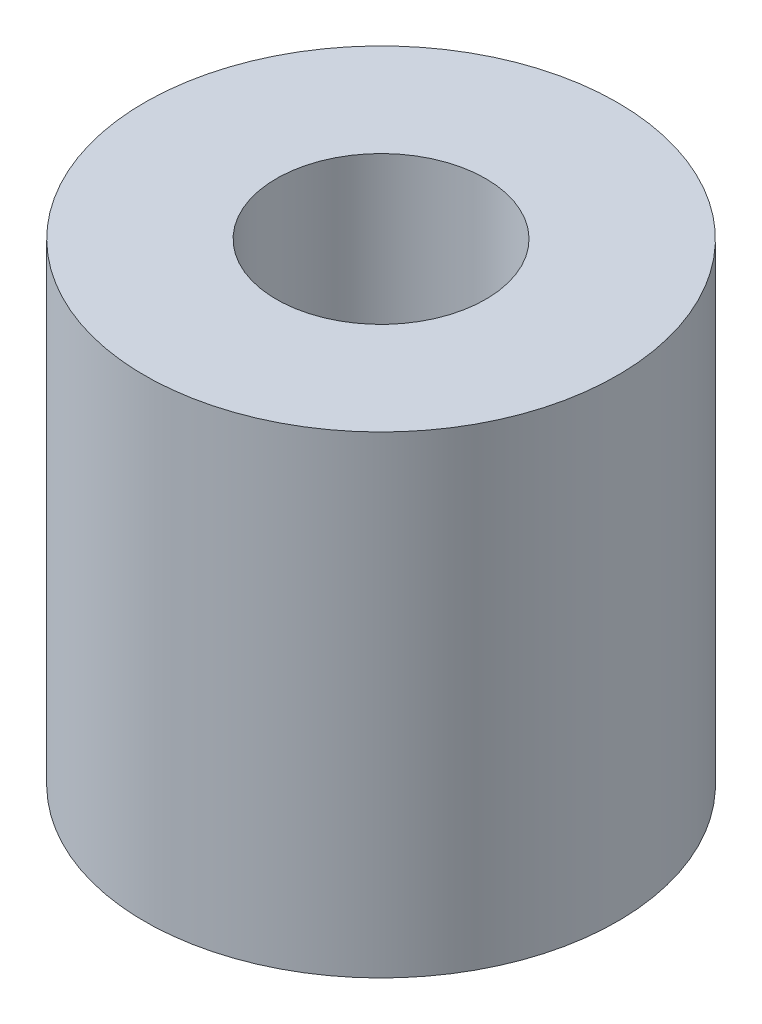
ISO-10303-21;
HEADER;
FILE_DESCRIPTION(('STEP AP214'),'2;1');
FILE_NAME('part.step','',(''),(''),'','','');
FILE_SCHEMA(('AUTOMOTIVE_DESIGN { 1 0 10303 214 1 1 1 1 }'));
ENDSEC;
DATA;
#1=APPLICATION_CONTEXT('core data for automotive mechanical design processes');
#2=APPLICATION_PROTOCOL_DEFINITION('international standard','automotive_design',2000,#1);
#3=PRODUCT_CONTEXT('',#1,'mechanical');
#4=PRODUCT('Part','Part','',(#3));
#5=PRODUCT_RELATED_PRODUCT_CATEGORY('part','',(#4));
#6=PRODUCT_DEFINITION_FORMATION('','',#4);
#7=PRODUCT_DEFINITION_CONTEXT('part definition',#1,'design');
#8=PRODUCT_DEFINITION('design','',#6,#7);
#9=PRODUCT_DEFINITION_SHAPE('','',#8);
#10=(LENGTH_UNIT() NAMED_UNIT(*) SI_UNIT(.MILLI.,.METRE.));
#11=(NAMED_UNIT(*) PLANE_ANGLE_UNIT() SI_UNIT($,.RADIAN.));
#12=(NAMED_UNIT(*) SI_UNIT($,.STERADIAN.) SOLID_ANGLE_UNIT());
#13=UNCERTAINTY_MEASURE_WITH_UNIT(LENGTH_MEASURE(1.E-05),#10,'distance_accuracy_value','');
#14=(GEOMETRIC_REPRESENTATION_CONTEXT(3) GLOBAL_UNCERTAINTY_ASSIGNED_CONTEXT((#13)) GLOBAL_UNIT_ASSIGNED_CONTEXT((#10,
#11,#12)) REPRESENTATION_CONTEXT('',''));
#15=CARTESIAN_POINT('',(0.,0.,0.));
#16=DIRECTION('',(0.,0.,1.));
#17=DIRECTION('',(1.,0.,0.));
#18=AXIS2_PLACEMENT_3D('',#15,#16,#17);
#19=CARTESIAN_POINT('',(0.,9.525,0.));
#20=DIRECTION('',(0.,1.,0.));
#21=DIRECTION('',(0.,0.,1.));
#22=AXIS2_PLACEMENT_3D('',#19,#20,#21);
#23=PLANE('',#22);
#24=CARTESIAN_POINT('',(0.,9.525,0.));
#25=DIRECTION('',(0.,1.,0.));
#26=DIRECTION('',(0.,0.,1.));
#27=AXIS2_PLACEMENT_3D('',#24,#25,#26);
#28=CIRCLE('',#27,4.7625);
#29=CARTESIAN_POINT('',(0.,9.525,-4.7625));
#30=VERTEX_POINT('',#29);
#31=EDGE_CURVE('E10',#30,#30,#28,.T.);
#32=ORIENTED_EDGE('',*,*,#31,.T.);
#33=EDGE_LOOP('',(#32));
#34=FACE_BOUND('',#33,.T.);
#35=CARTESIAN_POINT('',(0.,9.525,0.));
#36=DIRECTION('',(0.,1.,0.));
#37=DIRECTION('',(0.,0.,1.));
#38=AXIS2_PLACEMENT_3D('',#35,#36,#37);
#39=CIRCLE('',#38,2.1082);
#40=CARTESIAN_POINT('',(0.,9.525,-2.1082));
#41=VERTEX_POINT('',#40);
#42=EDGE_CURVE('E50',#41,#41,#39,.T.);
#43=ORIENTED_EDGE('',*,*,#42,.F.);
#44=EDGE_LOOP('',(#43));
#45=FACE_BOUND('',#44,.T.);
#46=ADVANCED_FACE('F37',(#34,#45),#23,.T.);
#47=CARTESIAN_POINT('',(0.,0.,0.));
#48=DIRECTION('',(0.,1.,0.));
#49=DIRECTION('',(0.,0.,1.));
#50=AXIS2_PLACEMENT_3D('',#47,#48,#49);
#51=PLANE('',#50);
#52=CARTESIAN_POINT('',(0.,0.,0.));
#53=DIRECTION('',(0.,1.,0.));
#54=DIRECTION('',(0.,0.,1.));
#55=AXIS2_PLACEMENT_3D('',#52,#53,#54);
#56=CIRCLE('',#55,4.7625);
#57=CARTESIAN_POINT('',(0.,0.,-4.7625));
#58=VERTEX_POINT('',#57);
#59=EDGE_CURVE('E41',#58,#58,#56,.T.);
#60=ORIENTED_EDGE('',*,*,#59,.F.);
#61=EDGE_LOOP('',(#60));
#62=FACE_BOUND('',#61,.T.);
#63=CARTESIAN_POINT('',(0.,0.,0.));
#64=DIRECTION('',(0.,1.,0.));
#65=DIRECTION('',(0.,0.,1.));
#66=AXIS2_PLACEMENT_3D('',#63,#64,#65);
#67=CIRCLE('',#66,2.1082);
#68=CARTESIAN_POINT('',(0.,0.,-2.1082));
#69=VERTEX_POINT('',#68);
#70=EDGE_CURVE('E52',#69,#69,#67,.T.);
#71=ORIENTED_EDGE('',*,*,#70,.T.);
#72=EDGE_LOOP('',(#71));
#73=FACE_BOUND('',#72,.T.);
#74=ADVANCED_FACE('F64',(#62,#73),#51,.F.);
#75=CARTESIAN_POINT('',(0.,9.525,0.));
#76=DIRECTION('',(0.,-1.,0.));
#77=DIRECTION('',(0.,0.,-1.));
#78=AXIS2_PLACEMENT_3D('',#75,#76,#77);
#79=CYLINDRICAL_SURFACE('',#78,4.7625);
#80=CARTESIAN_POINT('',(0.,9.525,-4.7625));
#81=CARTESIAN_POINT('',(0.,9.42578125,-4.7625));
#82=CARTESIAN_POINT('',(0.,9.3265625,-4.7625));
#83=CARTESIAN_POINT('',(0.,9.128125,-4.7625));
#84=CARTESIAN_POINT('',(0.,9.02890625,-4.7625));
#85=CARTESIAN_POINT('',(0.,8.83046875,-4.7625));
#86=CARTESIAN_POINT('',(0.,8.73125,-4.7625));
#87=CARTESIAN_POINT('',(0.,8.5328125,-4.7625));
#88=CARTESIAN_POINT('',(0.,8.43359375,-4.7625));
#89=CARTESIAN_POINT('',(0.,8.23515625,-4.7625));
#90=CARTESIAN_POINT('',(0.,8.1359375,-4.7625));
#91=CARTESIAN_POINT('',(0.,7.9375,-4.7625));
#92=CARTESIAN_POINT('',(0.,7.83828125,-4.7625));
#93=CARTESIAN_POINT('',(0.,7.63984375,-4.7625));
#94=CARTESIAN_POINT('',(0.,7.540625,-4.7625));
#95=CARTESIAN_POINT('',(0.,7.3421875,-4.7625));
#96=CARTESIAN_POINT('',(0.,7.24296875,-4.7625));
#97=CARTESIAN_POINT('',(0.,7.04453125,-4.7625));
#98=CARTESIAN_POINT('',(0.,6.9453125,-4.7625));
#99=CARTESIAN_POINT('',(0.,6.746875,-4.7625));
#100=CARTESIAN_POINT('',(0.,6.64765625,-4.7625));
#101=CARTESIAN_POINT('',(0.,6.44921875,-4.7625));
#102=CARTESIAN_POINT('',(0.,6.35,-4.7625));
#103=CARTESIAN_POINT('',(0.,6.1515625,-4.7625));
#104=CARTESIAN_POINT('',(0.,6.05234375,-4.7625));
#105=CARTESIAN_POINT('',(0.,5.85390625,-4.7625));
#106=CARTESIAN_POINT('',(0.,5.7546875,-4.7625));
#107=CARTESIAN_POINT('',(0.,5.55625,-4.7625));
#108=CARTESIAN_POINT('',(0.,5.45703125,-4.7625));
#109=CARTESIAN_POINT('',(0.,5.25859375,-4.7625));
#110=CARTESIAN_POINT('',(0.,5.159375,-4.7625));
#111=CARTESIAN_POINT('',(0.,4.9609375,-4.7625));
#112=CARTESIAN_POINT('',(0.,4.86171875,-4.7625));
#113=CARTESIAN_POINT('',(0.,4.66328125,-4.7625));
#114=CARTESIAN_POINT('',(0.,4.5640625,-4.7625));
#115=CARTESIAN_POINT('',(0.,4.365625,-4.7625));
#116=CARTESIAN_POINT('',(0.,4.26640625,-4.7625));
#117=CARTESIAN_POINT('',(0.,4.06796875,-4.7625));
#118=CARTESIAN_POINT('',(0.,3.96875,-4.7625));
#119=CARTESIAN_POINT('',(0.,3.7703125,-4.7625));
#120=CARTESIAN_POINT('',(0.,3.67109375,-4.7625));
#121=CARTESIAN_POINT('',(0.,3.47265625,-4.7625));
#122=CARTESIAN_POINT('',(0.,3.3734375,-4.7625));
#123=CARTESIAN_POINT('',(0.,3.175,-4.7625));
#124=CARTESIAN_POINT('',(0.,3.07578125,-4.7625));
#125=CARTESIAN_POINT('',(0.,2.87734375,-4.7625));
#126=CARTESIAN_POINT('',(0.,2.778125,-4.7625));
#127=CARTESIAN_POINT('',(0.,2.5796875,-4.7625));
#128=CARTESIAN_POINT('',(0.,2.48046875,-4.7625));
#129=CARTESIAN_POINT('',(0.,2.28203125,-4.7625));
#130=CARTESIAN_POINT('',(0.,2.1828125,-4.7625));
#131=CARTESIAN_POINT('',(0.,1.984375,-4.7625));
#132=CARTESIAN_POINT('',(0.,1.88515625,-4.7625));
#133=CARTESIAN_POINT('',(0.,1.68671875,-4.7625));
#134=CARTESIAN_POINT('',(0.,1.5875,-4.7625));
#135=CARTESIAN_POINT('',(0.,1.3890625,-4.7625));
#136=CARTESIAN_POINT('',(0.,1.28984375,-4.7625));
#137=CARTESIAN_POINT('',(0.,1.09140625,-4.7625));
#138=CARTESIAN_POINT('',(0.,0.992187500000001,-4.7625));
#139=CARTESIAN_POINT('',(0.,0.793750000000001,-4.7625));
#140=CARTESIAN_POINT('',(0.,0.69453125,-4.7625));
#141=CARTESIAN_POINT('',(0.,0.49609375,-4.7625));
#142=CARTESIAN_POINT('',(0.,0.396875,-4.7625));
#143=CARTESIAN_POINT('',(0.,0.1984375,-4.7625));
#144=CARTESIAN_POINT('',(0.,0.0992187500000001,-4.7625));
#145=CARTESIAN_POINT('',(0.,0.,-4.7625));
#146=B_SPLINE_CURVE_WITH_KNOTS('',3,(#80,#81,#82,#83,#84,#85,#86,#87,#88,#89,#90,#91,#92,#93,
#94,#95,#96,#97,#98,#99,#100,#101,#102,#103,#104,#105,#106,#107,#108,#109,#110,#111,#112,#113,
#114,#115,#116,#117,#118,#119,#120,#121,#122,#123,#124,#125,#126,#127,#128,#129,#130,#131,#132,
#133,#134,#135,#136,#137,#138,#139,#140,#141,#142,#143,#144,#145),.UNSPECIFIED.,.F.,.F.,(4,2,2,
2,2,2,2,2,2,2,2,2,2,2,2,2,2,2,2,2,2,2,2,2,2,2,2,2,2,2,2,2,4),(0.,0.29765625,0.5953125,
0.892968750000001,1.190625,1.48828125,1.7859375,2.08359375,2.38125,2.67890625,2.9765625,
3.27421875,3.571875,3.86953125,4.1671875,4.46484375,4.7625,5.06015625,5.3578125,5.65546875,
5.953125,6.25078125,6.5484375,6.84609375,7.14375,7.44140625,7.7390625,8.03671875,8.334375,
8.63203125,8.9296875,9.22734375,9.525),.UNSPECIFIED.);
#147=EDGE_CURVE('BSEAM39',#30,#58,#146,.T.);
#148=ORIENTED_EDGE('',*,*,#31,.F.);
#149=ORIENTED_EDGE('',*,*,#59,.T.);
#150=ORIENTED_EDGE('',*,*,#147,.T.);
#151=ORIENTED_EDGE('',*,*,#147,.F.);
#152=EDGE_LOOP('',(#148,#150,#149,#151));
#153=FACE_BOUND('',#152,.T.);
#154=ADVANCED_FACE('F39',(#153),#79,.T.);
#155=CARTESIAN_POINT('',(0.,9.525,0.));
#156=DIRECTION('',(0.,-1.,0.));
#157=DIRECTION('',(0.,0.,-1.));
#158=AXIS2_PLACEMENT_3D('',#155,#156,#157);
#159=CYLINDRICAL_SURFACE('',#158,2.1082);
#160=CARTESIAN_POINT('',(0.,9.525,-2.1082));
#161=CARTESIAN_POINT('',(0.,9.42578125,-2.1082));
#162=CARTESIAN_POINT('',(0.,9.3265625,-2.1082));
#163=CARTESIAN_POINT('',(0.,9.128125,-2.1082));
#164=CARTESIAN_POINT('',(0.,9.02890625,-2.1082));
#165=CARTESIAN_POINT('',(0.,8.83046875,-2.1082));
#166=CARTESIAN_POINT('',(0.,8.73125,-2.1082));
#167=CARTESIAN_POINT('',(0.,8.5328125,-2.1082));
#168=CARTESIAN_POINT('',(0.,8.43359375,-2.1082));
#169=CARTESIAN_POINT('',(0.,8.23515625,-2.1082));
#170=CARTESIAN_POINT('',(0.,8.1359375,-2.1082));
#171=CARTESIAN_POINT('',(0.,7.9375,-2.1082));
#172=CARTESIAN_POINT('',(0.,7.83828125,-2.1082));
#173=CARTESIAN_POINT('',(0.,7.63984375,-2.1082));
#174=CARTESIAN_POINT('',(0.,7.540625,-2.1082));
#175=CARTESIAN_POINT('',(0.,7.3421875,-2.1082));
#176=CARTESIAN_POINT('',(0.,7.24296875,-2.1082));
#177=CARTESIAN_POINT('',(0.,7.04453125,-2.1082));
#178=CARTESIAN_POINT('',(0.,6.9453125,-2.1082));
#179=CARTESIAN_POINT('',(0.,6.746875,-2.1082));
#180=CARTESIAN_POINT('',(0.,6.64765625,-2.1082));
#181=CARTESIAN_POINT('',(0.,6.44921875,-2.1082));
#182=CARTESIAN_POINT('',(0.,6.35,-2.1082));
#183=CARTESIAN_POINT('',(0.,6.1515625,-2.1082));
#184=CARTESIAN_POINT('',(0.,6.05234375,-2.1082));
#185=CARTESIAN_POINT('',(0.,5.85390625,-2.1082));
#186=CARTESIAN_POINT('',(0.,5.7546875,-2.1082));
#187=CARTESIAN_POINT('',(0.,5.55625,-2.1082));
#188=CARTESIAN_POINT('',(0.,5.45703125,-2.1082));
#189=CARTESIAN_POINT('',(0.,5.25859375,-2.1082));
#190=CARTESIAN_POINT('',(0.,5.159375,-2.1082));
#191=CARTESIAN_POINT('',(0.,4.9609375,-2.1082));
#192=CARTESIAN_POINT('',(0.,4.86171875,-2.1082));
#193=CARTESIAN_POINT('',(0.,4.66328125,-2.1082));
#194=CARTESIAN_POINT('',(0.,4.5640625,-2.1082));
#195=CARTESIAN_POINT('',(0.,4.365625,-2.1082));
#196=CARTESIAN_POINT('',(0.,4.26640625,-2.1082));
#197=CARTESIAN_POINT('',(0.,4.06796875,-2.1082));
#198=CARTESIAN_POINT('',(0.,3.96875,-2.1082));
#199=CARTESIAN_POINT('',(0.,3.7703125,-2.1082));
#200=CARTESIAN_POINT('',(0.,3.67109375,-2.1082));
#201=CARTESIAN_POINT('',(0.,3.47265625,-2.1082));
#202=CARTESIAN_POINT('',(0.,3.3734375,-2.1082));
#203=CARTESIAN_POINT('',(0.,3.175,-2.1082));
#204=CARTESIAN_POINT('',(0.,3.07578125,-2.1082));
#205=CARTESIAN_POINT('',(0.,2.87734375,-2.1082));
#206=CARTESIAN_POINT('',(0.,2.778125,-2.1082));
#207=CARTESIAN_POINT('',(0.,2.5796875,-2.1082));
#208=CARTESIAN_POINT('',(0.,2.48046875,-2.1082));
#209=CARTESIAN_POINT('',(0.,2.28203125,-2.1082));
#210=CARTESIAN_POINT('',(0.,2.1828125,-2.1082));
#211=CARTESIAN_POINT('',(0.,1.984375,-2.1082));
#212=CARTESIAN_POINT('',(0.,1.88515625,-2.1082));
#213=CARTESIAN_POINT('',(0.,1.68671875,-2.1082));
#214=CARTESIAN_POINT('',(0.,1.5875,-2.1082));
#215=CARTESIAN_POINT('',(0.,1.3890625,-2.1082));
#216=CARTESIAN_POINT('',(0.,1.28984375,-2.1082));
#217=CARTESIAN_POINT('',(0.,1.09140625,-2.1082));
#218=CARTESIAN_POINT('',(0.,0.992187500000001,-2.1082));
#219=CARTESIAN_POINT('',(0.,0.793750000000001,-2.1082));
#220=CARTESIAN_POINT('',(0.,0.69453125,-2.1082));
#221=CARTESIAN_POINT('',(0.,0.49609375,-2.1082));
#222=CARTESIAN_POINT('',(0.,0.396875,-2.1082));
#223=CARTESIAN_POINT('',(0.,0.1984375,-2.1082));
#224=CARTESIAN_POINT('',(0.,0.0992187500000001,-2.1082));
#225=CARTESIAN_POINT('',(0.,0.,-2.1082));
#226=B_SPLINE_CURVE_WITH_KNOTS('',3,(#160,#161,#162,#163,#164,#165,#166,#167,#168,#169,#170,
#171,#172,#173,#174,#175,#176,#177,#178,#179,#180,#181,#182,#183,#184,#185,#186,#187,#188,#189,
#190,#191,#192,#193,#194,#195,#196,#197,#198,#199,#200,#201,#202,#203,#204,#205,#206,#207,#208,
#209,#210,#211,#212,#213,#214,#215,#216,#217,#218,#219,#220,#221,#222,#223,#224,#225),
.UNSPECIFIED.,.F.,.F.,(4,2,2,2,2,2,2,2,2,2,2,2,2,2,2,2,2,2,2,2,2,2,2,2,2,2,2,2,2,2,2,2,4),(0.,
0.29765625,0.5953125,0.892968750000001,1.190625,1.48828125,1.7859375,2.08359375,2.38125,
2.67890625,2.9765625,3.27421875,3.571875,3.86953125,4.1671875,4.46484375,4.7625,5.06015625,
5.3578125,5.65546875,5.953125,6.25078125,6.5484375,6.84609375,7.14375,7.44140625,7.7390625,
8.03671875,8.334375,8.63203125,8.9296875,9.22734375,9.525),.UNSPECIFIED.);
#227=EDGE_CURVE('BSEAM60',#41,#69,#226,.T.);
#228=ORIENTED_EDGE('',*,*,#42,.T.);
#229=ORIENTED_EDGE('',*,*,#70,.F.);
#230=ORIENTED_EDGE('',*,*,#227,.T.);
#231=ORIENTED_EDGE('',*,*,#227,.F.);
#232=EDGE_LOOP('',(#228,#230,#229,#231));
#233=FACE_BOUND('',#232,.T.);
#234=ADVANCED_FACE('F60',(#233),#159,.F.);
#235=CLOSED_SHELL('',(#46,#74,#154,#234));
#236=MANIFOLD_SOLID_BREP('B2',#235);
#237=ADVANCED_BREP_SHAPE_REPRESENTATION('',(#18,#236),#14);
#238=SHAPE_DEFINITION_REPRESENTATION(#9,#237);
ENDSEC;
END-ISO-10303-21;
